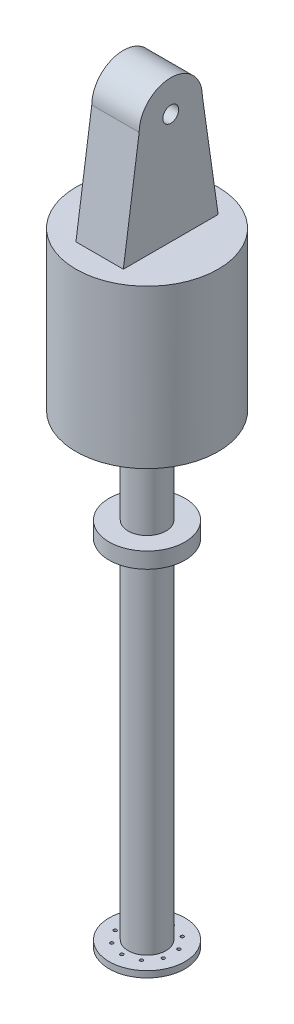
ISO-10303-21;
HEADER;
FILE_DESCRIPTION(('STEP AP214'),'2;1');
FILE_NAME('part.step','',(''),(''),'','','');
FILE_SCHEMA(('AUTOMOTIVE_DESIGN { 1 0 10303 214 1 1 1 1 }'));
ENDSEC;
DATA;
#1=APPLICATION_CONTEXT('core data for automotive mechanical design processes');
#2=APPLICATION_PROTOCOL_DEFINITION('international standard','automotive_design',2000,#1);
#3=PRODUCT_CONTEXT('',#1,'mechanical');
#4=PRODUCT('Part','Part','',(#3));
#5=PRODUCT_RELATED_PRODUCT_CATEGORY('part','',(#4));
#6=PRODUCT_DEFINITION_FORMATION('','',#4);
#7=PRODUCT_DEFINITION_CONTEXT('part definition',#1,'design');
#8=PRODUCT_DEFINITION('design','',#6,#7);
#9=PRODUCT_DEFINITION_SHAPE('','',#8);
#10=(LENGTH_UNIT() NAMED_UNIT(*) SI_UNIT(.MILLI.,.METRE.));
#11=(NAMED_UNIT(*) PLANE_ANGLE_UNIT() SI_UNIT($,.RADIAN.));
#12=(NAMED_UNIT(*) SI_UNIT($,.STERADIAN.) SOLID_ANGLE_UNIT());
#13=UNCERTAINTY_MEASURE_WITH_UNIT(LENGTH_MEASURE(1.E-05),#10,'distance_accuracy_value','');
#14=(GEOMETRIC_REPRESENTATION_CONTEXT(3) GLOBAL_UNCERTAINTY_ASSIGNED_CONTEXT((#13)) GLOBAL_UNIT_ASSIGNED_CONTEXT((#10,
#11,#12)) REPRESENTATION_CONTEXT('',''));
#15=CARTESIAN_POINT('',(0.,0.,0.));
#16=DIRECTION('',(0.,0.,1.));
#17=DIRECTION('',(1.,0.,0.));
#18=AXIS2_PLACEMENT_3D('',#15,#16,#17);
#19=CARTESIAN_POINT('',(15.,64.,0.));
#20=DIRECTION('',(1.,0.,0.));
#21=DIRECTION('',(0.,0.,-1.));
#22=AXIS2_PLACEMENT_3D('',#19,#20,#21);
#23=PLANE('',#22);
#24=DIRECTION('',(0.,0.989949493661166,0.141421356237309));
#25=VECTOR('',#24,1.);
#26=CARTESIAN_POINT('',(15.,29.,-15.));
#27=LINE('',#26,#25);
#28=CARTESIAN_POINT('',(15.,29.,-15.));
#29=VERTEX_POINT('',#28);
#30=CARTESIAN_POINT('',(15.,64.,-10.));
#31=VERTEX_POINT('',#30);
#32=EDGE_CURVE('E97',#29,#31,#27,.T.);
#33=ORIENTED_EDGE('',*,*,#32,.T.);
#34=CARTESIAN_POINT('',(15.,64.,0.));
#35=DIRECTION('',(1.,0.,0.));
#36=DIRECTION('',(0.,0.,-1.));
#37=AXIS2_PLACEMENT_3D('',#34,#35,#36);
#38=CIRCLE('',#37,10.);
#39=CARTESIAN_POINT('',(15.,64.,10.));
#40=VERTEX_POINT('',#39);
#41=EDGE_CURVE('E83',#31,#40,#38,.T.);
#42=ORIENTED_EDGE('',*,*,#41,.T.);
#43=DIRECTION('',(0.,-0.989949493661166,0.141421356237309));
#44=VECTOR('',#43,1.);
#45=CARTESIAN_POINT('',(15.,64.,10.));
#46=LINE('',#45,#44);
#47=CARTESIAN_POINT('',(15.,29.,15.));
#48=VERTEX_POINT('',#47);
#49=EDGE_CURVE('E115',#40,#48,#46,.T.);
#50=ORIENTED_EDGE('',*,*,#49,.T.);
#51=DIRECTION('',(0.,0.,-1.));
#52=VECTOR('',#51,1.);
#53=CARTESIAN_POINT('',(15.,29.,15.));
#54=LINE('',#53,#52);
#55=EDGE_CURVE('E57',#48,#29,#54,.T.);
#56=ORIENTED_EDGE('',*,*,#55,.T.);
#57=EDGE_LOOP('',(#33,#42,#50,#56));
#58=FACE_BOUND('',#57,.T.);
#59=CARTESIAN_POINT('',(15.,64.,0.));
#60=DIRECTION('',(1.,0.,0.));
#61=DIRECTION('',(0.,0.,-1.));
#62=AXIS2_PLACEMENT_3D('',#59,#60,#61);
#63=CIRCLE('',#62,2.5);
#64=CARTESIAN_POINT('',(15.,64.,-2.5));
#65=VERTEX_POINT('',#64);
#66=EDGE_CURVE('E113',#65,#65,#63,.T.);
#67=ORIENTED_EDGE('',*,*,#66,.F.);
#68=EDGE_LOOP('',(#67));
#69=FACE_BOUND('',#68,.T.);
#70=ADVANCED_FACE('F38',(#58,#69),#23,.T.);
#71=CARTESIAN_POINT('',(0.,64.,0.));
#72=DIRECTION('',(1.,0.,0.));
#73=DIRECTION('',(0.,0.,-1.));
#74=AXIS2_PLACEMENT_3D('',#71,#72,#73);
#75=PLANE('',#74);
#76=DIRECTION('',(0.,0.989949493661166,0.141421356237309));
#77=VECTOR('',#76,1.);
#78=CARTESIAN_POINT('',(0.,29.,-15.));
#79=LINE('',#78,#77);
#80=CARTESIAN_POINT('',(0.,29.,-15.));
#81=VERTEX_POINT('',#80);
#82=CARTESIAN_POINT('',(0.,64.,-10.));
#83=VERTEX_POINT('',#82);
#84=EDGE_CURVE('E94',#81,#83,#79,.T.);
#85=ORIENTED_EDGE('',*,*,#84,.F.);
#86=DIRECTION('',(0.,0.,-1.));
#87=VECTOR('',#86,1.);
#88=CARTESIAN_POINT('',(0.,29.,15.));
#89=LINE('',#88,#87);
#90=CARTESIAN_POINT('',(0.,29.,15.));
#91=VERTEX_POINT('',#90);
#92=EDGE_CURVE('E89',#91,#81,#89,.T.);
#93=ORIENTED_EDGE('',*,*,#92,.F.);
#94=DIRECTION('',(0.,-0.989949493661166,0.141421356237309));
#95=VECTOR('',#94,1.);
#96=CARTESIAN_POINT('',(0.,64.,10.));
#97=LINE('',#96,#95);
#98=CARTESIAN_POINT('',(0.,64.,10.));
#99=VERTEX_POINT('',#98);
#100=EDGE_CURVE('E93',#99,#91,#97,.T.);
#101=ORIENTED_EDGE('',*,*,#100,.F.);
#102=CARTESIAN_POINT('',(0.,64.,0.));
#103=DIRECTION('',(1.,0.,0.));
#104=DIRECTION('',(0.,0.,-1.));
#105=AXIS2_PLACEMENT_3D('',#102,#103,#104);
#106=CIRCLE('',#105,10.);
#107=EDGE_CURVE('E71',#83,#99,#106,.T.);
#108=ORIENTED_EDGE('',*,*,#107,.F.);
#109=EDGE_LOOP('',(#85,#93,#101,#108));
#110=FACE_BOUND('',#109,.T.);
#111=CARTESIAN_POINT('',(0.,64.,0.));
#112=DIRECTION('',(1.,0.,0.));
#113=DIRECTION('',(0.,0.,-1.));
#114=AXIS2_PLACEMENT_3D('',#111,#112,#113);
#115=CIRCLE('',#114,2.5);
#116=CARTESIAN_POINT('',(0.,64.,-2.5));
#117=VERTEX_POINT('',#116);
#118=EDGE_CURVE('E119',#117,#117,#115,.T.);
#119=ORIENTED_EDGE('',*,*,#118,.T.);
#120=EDGE_LOOP('',(#119));
#121=FACE_BOUND('',#120,.T.);
#122=ADVANCED_FACE('F91',(#110,#121),#75,.F.);
#123=CARTESIAN_POINT('',(15.,29.,-15.));
#124=DIRECTION('',(0.,-0.141421356237309,0.989949493661166));
#125=DIRECTION('',(0.,-0.989949493661167,-0.141421356237309));
#126=AXIS2_PLACEMENT_3D('',#123,#124,#125);
#127=PLANE('',#126);
#128=ORIENTED_EDGE('',*,*,#84,.T.);
#129=DIRECTION('',(-1.,0.,0.));
#130=VECTOR('',#129,1.);
#131=CARTESIAN_POINT('',(15.,64.,-10.));
#132=LINE('',#131,#130);
#133=EDGE_CURVE('E42',#31,#83,#132,.T.);
#134=ORIENTED_EDGE('',*,*,#133,.F.);
#135=ORIENTED_EDGE('',*,*,#32,.F.);
#136=DIRECTION('',(-1.,0.,0.));
#137=VECTOR('',#136,1.);
#138=CARTESIAN_POINT('',(15.,29.,-15.));
#139=LINE('',#138,#137);
#140=EDGE_CURVE('E78',#29,#81,#139,.T.);
#141=ORIENTED_EDGE('',*,*,#140,.T.);
#142=EDGE_LOOP('',(#128,#134,#135,#141));
#143=FACE_BOUND('',#142,.T.);
#144=ADVANCED_FACE('F40',(#143),#127,.F.);
#145=CARTESIAN_POINT('',(15.,64.,0.));
#146=DIRECTION('',(-1.,0.,0.));
#147=DIRECTION('',(0.,0.,1.));
#148=AXIS2_PLACEMENT_3D('',#145,#146,#147);
#149=CYLINDRICAL_SURFACE('',#148,10.);
#150=ORIENTED_EDGE('',*,*,#107,.T.);
#151=DIRECTION('',(-1.,0.,0.));
#152=VECTOR('',#151,1.);
#153=CARTESIAN_POINT('',(15.,64.,10.));
#154=LINE('',#153,#152);
#155=EDGE_CURVE('E104',#40,#99,#154,.T.);
#156=ORIENTED_EDGE('',*,*,#155,.F.);
#157=ORIENTED_EDGE('',*,*,#41,.F.);
#158=ORIENTED_EDGE('',*,*,#133,.T.);
#159=EDGE_LOOP('',(#150,#156,#157,#158));
#160=FACE_BOUND('',#159,.T.);
#161=ADVANCED_FACE('F263',(#160),#149,.T.);
#162=CARTESIAN_POINT('',(15.,64.,10.));
#163=DIRECTION('',(0.,-0.141421356237309,-0.989949493661166));
#164=DIRECTION('',(0.,0.989949493661167,-0.141421356237309));
#165=AXIS2_PLACEMENT_3D('',#162,#163,#164);
#166=PLANE('',#165);
#167=ORIENTED_EDGE('',*,*,#100,.T.);
#168=DIRECTION('',(-1.,0.,0.));
#169=VECTOR('',#168,1.);
#170=CARTESIAN_POINT('',(15.,29.,15.));
#171=LINE('',#170,#169);
#172=EDGE_CURVE('E103',#48,#91,#171,.T.);
#173=ORIENTED_EDGE('',*,*,#172,.F.);
#174=ORIENTED_EDGE('',*,*,#49,.F.);
#175=ORIENTED_EDGE('',*,*,#155,.T.);
#176=EDGE_LOOP('',(#167,#173,#174,#175));
#177=FACE_BOUND('',#176,.T.);
#178=ADVANCED_FACE('F101',(#177),#166,.F.);
#179=CARTESIAN_POINT('',(15.,64.,0.));
#180=DIRECTION('',(-1.,0.,0.));
#181=DIRECTION('',(0.,0.,1.));
#182=AXIS2_PLACEMENT_3D('',#179,#180,#181);
#183=CYLINDRICAL_SURFACE('',#182,2.5);
#184=ORIENTED_EDGE('',*,*,#66,.T.);
#185=EDGE_LOOP('',(#184));
#186=FACE_BOUND('',#185,.T.);
#187=ORIENTED_EDGE('',*,*,#118,.F.);
#188=EDGE_LOOP('',(#187));
#189=FACE_BOUND('',#188,.T.);
#190=ADVANCED_FACE('F259',(#186,#189),#183,.F.);
#191=CARTESIAN_POINT('',(7.5,92.6396103067893,0.));
#192=DIRECTION('',(0.,-1.,0.));
#193=DIRECTION('',(0.,0.,-1.));
#194=AXIS2_PLACEMENT_3D('',#191,#192,#193);
#195=CYLINDRICAL_SURFACE('',#194,22.5);
#196=CARTESIAN_POINT('',(7.5,29.,0.));
#197=DIRECTION('',(0.,1.,0.));
#198=DIRECTION('',(0.,0.,1.));
#199=AXIS2_PLACEMENT_3D('',#196,#197,#198);
#200=CIRCLE('',#199,22.5);
#201=CARTESIAN_POINT('',(7.5,29.,22.5));
#202=VERTEX_POINT('',#201);
#203=EDGE_CURVE('E122',#202,#202,#200,.T.);
#204=ORIENTED_EDGE('',*,*,#203,.F.);
#205=EDGE_LOOP('',(#204));
#206=FACE_BOUND('',#205,.T.);
#207=CARTESIAN_POINT('',(7.5,-21.,0.));
#208=DIRECTION('',(0.,-1.,0.));
#209=DIRECTION('',(0.,0.,-1.));
#210=AXIS2_PLACEMENT_3D('',#207,#208,#209);
#211=CIRCLE('',#210,22.5);
#212=CARTESIAN_POINT('',(7.5,-21.,-22.5));
#213=VERTEX_POINT('',#212);
#214=EDGE_CURVE('E127',#213,#213,#211,.T.);
#215=ORIENTED_EDGE('',*,*,#214,.F.);
#216=EDGE_LOOP('',(#215));
#217=FACE_BOUND('',#216,.T.);
#218=ADVANCED_FACE('F288',(#206,#217),#195,.T.);
#219=CARTESIAN_POINT('',(15.,29.,15.));
#220=DIRECTION('',(0.,1.,0.));
#221=DIRECTION('',(0.,0.,1.));
#222=AXIS2_PLACEMENT_3D('',#219,#220,#221);
#223=PLANE('',#222);
#224=ORIENTED_EDGE('',*,*,#172,.T.);
#225=ORIENTED_EDGE('',*,*,#92,.T.);
#226=ORIENTED_EDGE('',*,*,#140,.F.);
#227=ORIENTED_EDGE('',*,*,#55,.F.);
#228=EDGE_LOOP('',(#224,#225,#226,#227));
#229=FACE_BOUND('',#228,.T.);
#230=ORIENTED_EDGE('',*,*,#203,.T.);
#231=EDGE_LOOP('',(#230));
#232=FACE_BOUND('',#231,.T.);
#233=ADVANCED_FACE('F106',(#229,#232),#223,.T.);
#234=CARTESIAN_POINT('',(7.5,-21.,0.));
#235=DIRECTION('',(0.,-1.,0.));
#236=DIRECTION('',(0.,0.,-1.));
#237=AXIS2_PLACEMENT_3D('',#234,#235,#236);
#238=PLANE('',#237);
#239=CARTESIAN_POINT('',(7.5,-21.,0.));
#240=DIRECTION('',(0.,-1.,0.));
#241=DIRECTION('',(0.,0.,-1.));
#242=AXIS2_PLACEMENT_3D('',#239,#240,#241);
#243=CIRCLE('',#242,6.);
#244=CARTESIAN_POINT('',(7.5,-21.,-6.));
#245=VERTEX_POINT('',#244);
#246=EDGE_CURVE('E48',#245,#245,#243,.T.);
#247=ORIENTED_EDGE('',*,*,#246,.F.);
#248=EDGE_LOOP('',(#247));
#249=FACE_BOUND('',#248,.T.);
#250=ORIENTED_EDGE('',*,*,#214,.T.);
#251=EDGE_LOOP('',(#250));
#252=FACE_BOUND('',#251,.T.);
#253=ADVANCED_FACE('F311',(#249,#252),#238,.T.);
#254=CARTESIAN_POINT('',(7.5,-51.,0.));
#255=DIRECTION('',(0.,1.,0.));
#256=DIRECTION('',(0.,0.,1.));
#257=AXIS2_PLACEMENT_3D('',#254,#255,#256);
#258=CYLINDRICAL_SURFACE('',#257,6.);
#259=CARTESIAN_POINT('',(7.5,-51.,0.));
#260=DIRECTION('',(0.,-1.,0.));
#261=DIRECTION('',(0.,0.,-1.));
#262=AXIS2_PLACEMENT_3D('',#259,#260,#261);
#263=CIRCLE('',#262,6.);
#264=CARTESIAN_POINT('',(7.5,-51.,-6.));
#265=VERTEX_POINT('',#264);
#266=EDGE_CURVE('E130',#265,#265,#263,.T.);
#267=ORIENTED_EDGE('',*,*,#266,.F.);
#268=EDGE_LOOP('',(#267));
#269=FACE_BOUND('',#268,.T.);
#270=ORIENTED_EDGE('',*,*,#246,.T.);
#271=EDGE_LOOP('',(#270));
#272=FACE_BOUND('',#271,.T.);
#273=ADVANCED_FACE('F328',(#269,#272),#258,.T.);
#274=CARTESIAN_POINT('',(7.5,-56.,0.));
#275=DIRECTION('',(0.,1.,0.));
#276=DIRECTION('',(0.,0.,1.));
#277=AXIS2_PLACEMENT_3D('',#274,#275,#276);
#278=CYLINDRICAL_SURFACE('',#277,12.);
#279=CARTESIAN_POINT('',(7.5,-56.,0.));
#280=DIRECTION('',(0.,-1.,0.));
#281=DIRECTION('',(0.,0.,-1.));
#282=AXIS2_PLACEMENT_3D('',#279,#280,#281);
#283=CIRCLE('',#282,12.);
#284=CARTESIAN_POINT('',(7.5,-56.,-12.));
#285=VERTEX_POINT('',#284);
#286=EDGE_CURVE('E135',#285,#285,#283,.T.);
#287=ORIENTED_EDGE('',*,*,#286,.F.);
#288=EDGE_LOOP('',(#287));
#289=FACE_BOUND('',#288,.T.);
#290=CARTESIAN_POINT('',(7.5,-51.,0.));
#291=DIRECTION('',(0.,-1.,0.));
#292=DIRECTION('',(0.,0.,-1.));
#293=AXIS2_PLACEMENT_3D('',#290,#291,#292);
#294=CIRCLE('',#293,12.);
#295=CARTESIAN_POINT('',(7.5,-51.,-12.));
#296=VERTEX_POINT('',#295);
#297=EDGE_CURVE('E136',#296,#296,#294,.T.);
#298=ORIENTED_EDGE('',*,*,#297,.T.);
#299=EDGE_LOOP('',(#298));
#300=FACE_BOUND('',#299,.T.);
#301=ADVANCED_FACE('F338',(#289,#300),#278,.T.);
#302=CARTESIAN_POINT('',(7.5,-56.,0.));
#303=DIRECTION('',(0.,-1.,0.));
#304=DIRECTION('',(0.,0.,-1.));
#305=AXIS2_PLACEMENT_3D('',#302,#303,#304);
#306=PLANE('',#305);
#307=CARTESIAN_POINT('',(7.5,-56.,0.));
#308=DIRECTION('',(0.,-1.,0.));
#309=DIRECTION('',(0.,0.,-1.));
#310=AXIS2_PLACEMENT_3D('',#307,#308,#309);
#311=CIRCLE('',#310,6.);
#312=CARTESIAN_POINT('',(7.5,-56.,-6.));
#313=VERTEX_POINT('',#312);
#314=EDGE_CURVE('E11',#313,#313,#311,.T.);
#315=ORIENTED_EDGE('',*,*,#314,.F.);
#316=EDGE_LOOP('',(#315));
#317=FACE_BOUND('',#316,.T.);
#318=ORIENTED_EDGE('',*,*,#286,.T.);
#319=EDGE_LOOP('',(#318));
#320=FACE_BOUND('',#319,.T.);
#321=ADVANCED_FACE('F348',(#317,#320),#306,.T.);
#322=CARTESIAN_POINT('',(7.5,-51.,0.));
#323=DIRECTION('',(0.,-1.,0.));
#324=DIRECTION('',(0.,0.,-1.));
#325=AXIS2_PLACEMENT_3D('',#322,#323,#324);
#326=PLANE('',#325);
#327=ORIENTED_EDGE('',*,*,#266,.T.);
#328=EDGE_LOOP('',(#327));
#329=FACE_BOUND('',#328,.T.);
#330=ORIENTED_EDGE('',*,*,#297,.F.);
#331=EDGE_LOOP('',(#330));
#332=FACE_BOUND('',#331,.T.);
#333=ADVANCED_FACE('F356',(#329,#332),#326,.F.);
#334=CARTESIAN_POINT('',(7.5,-166.,0.));
#335=DIRECTION('',(0.,1.,0.));
#336=DIRECTION('',(0.,0.,1.));
#337=AXIS2_PLACEMENT_3D('',#334,#335,#336);
#338=CYLINDRICAL_SURFACE('',#337,6.);
#339=CARTESIAN_POINT('',(7.5,-166.,0.));
#340=DIRECTION('',(0.,-1.,0.));
#341=DIRECTION('',(0.,0.,-1.));
#342=AXIS2_PLACEMENT_3D('',#339,#340,#341);
#343=CIRCLE('',#342,6.);
#344=CARTESIAN_POINT('',(7.5,-166.,-6.));
#345=VERTEX_POINT('',#344);
#346=EDGE_CURVE('E139',#345,#345,#343,.T.);
#347=ORIENTED_EDGE('',*,*,#346,.F.);
#348=EDGE_LOOP('',(#347));
#349=FACE_BOUND('',#348,.T.);
#350=ORIENTED_EDGE('',*,*,#314,.T.);
#351=EDGE_LOOP('',(#350));
#352=FACE_BOUND('',#351,.T.);
#353=ADVANCED_FACE('F361',(#349,#352),#338,.T.);
#354=CARTESIAN_POINT('',(7.5,-168.,8.));
#355=DIRECTION('',(0.,1.,0.));
#356=DIRECTION('',(0.,0.,1.));
#357=AXIS2_PLACEMENT_3D('',#354,#355,#356);
#358=CYLINDRICAL_SURFACE('',#357,0.500000000000001);
#359=CARTESIAN_POINT('',(7.5,-168.,8.));
#360=DIRECTION('',(0.,-1.,0.));
#361=DIRECTION('',(0.,0.,-1.));
#362=AXIS2_PLACEMENT_3D('',#359,#360,#361);
#363=CIRCLE('',#362,0.500000000000001);
#364=CARTESIAN_POINT('',(7.5,-168.,7.5));
#365=VERTEX_POINT('',#364);
#366=EDGE_CURVE('E181',#365,#365,#363,.T.);
#367=ORIENTED_EDGE('',*,*,#366,.T.);
#368=EDGE_LOOP('',(#367));
#369=FACE_BOUND('',#368,.T.);
#370=CARTESIAN_POINT('',(7.5,-166.,8.));
#371=DIRECTION('',(0.,-1.,0.));
#372=DIRECTION('',(0.,0.,-1.));
#373=AXIS2_PLACEMENT_3D('',#370,#371,#372);
#374=CIRCLE('',#373,0.500000000000001);
#375=CARTESIAN_POINT('',(7.5,-166.,7.5));
#376=VERTEX_POINT('',#375);
#377=EDGE_CURVE('E149',#376,#376,#374,.T.);
#378=ORIENTED_EDGE('',*,*,#377,.F.);
#379=EDGE_LOOP('',(#378));
#380=FACE_BOUND('',#379,.T.);
#381=ADVANCED_FACE('F378',(#369,#380),#358,.F.);
#382=CARTESIAN_POINT('',(2.79771798166021,-168.,6.47213595499958));
#383=DIRECTION('',(0.,1.,0.));
#384=DIRECTION('',(0.,0.,1.));
#385=AXIS2_PLACEMENT_3D('',#382,#383,#384);
#386=CYLINDRICAL_SURFACE('',#385,0.500000000000002);
#387=CARTESIAN_POINT('',(2.79771798166021,-168.,6.47213595499958));
#388=DIRECTION('',(0.,-1.,0.));
#389=DIRECTION('',(0.,0.,-1.));
#390=AXIS2_PLACEMENT_3D('',#387,#388,#389);
#391=CIRCLE('',#390,0.500000000000002);
#392=CARTESIAN_POINT('',(2.79771798166021,-168.,5.97213595499958));
#393=VERTEX_POINT('',#392);
#394=EDGE_CURVE('E184',#393,#393,#391,.T.);
#395=ORIENTED_EDGE('',*,*,#394,.T.);
#396=EDGE_LOOP('',(#395));
#397=FACE_BOUND('',#396,.T.);
#398=CARTESIAN_POINT('',(2.79771798166021,-166.,6.47213595499958));
#399=DIRECTION('',(0.,-1.,0.));
#400=DIRECTION('',(0.,0.,-1.));
#401=AXIS2_PLACEMENT_3D('',#398,#399,#400);
#402=CIRCLE('',#401,0.500000000000002);
#403=CARTESIAN_POINT('',(2.79771798166021,-166.,5.97213595499958));
#404=VERTEX_POINT('',#403);
#405=EDGE_CURVE('E152',#404,#404,#402,.T.);
#406=ORIENTED_EDGE('',*,*,#405,.F.);
#407=EDGE_LOOP('',(#406));
#408=FACE_BOUND('',#407,.T.);
#409=ADVANCED_FACE('F388',(#397,#408),#386,.F.);
#410=CARTESIAN_POINT('',(-0.10845213036123,-168.,2.47213595499958));
#411=DIRECTION('',(0.,1.,0.));
#412=DIRECTION('',(0.,0.,1.));
#413=AXIS2_PLACEMENT_3D('',#410,#411,#412);
#414=CYLINDRICAL_SURFACE('',#413,0.5);
#415=CARTESIAN_POINT('',(-0.10845213036123,-168.,2.47213595499958));
#416=DIRECTION('',(0.,-1.,0.));
#417=DIRECTION('',(0.,0.,-1.));
#418=AXIS2_PLACEMENT_3D('',#415,#416,#417);
#419=CIRCLE('',#418,0.5);
#420=CARTESIAN_POINT('',(-0.10845213036123,-168.,1.97213595499958));
#421=VERTEX_POINT('',#420);
#422=EDGE_CURVE('E187',#421,#421,#419,.T.);
#423=ORIENTED_EDGE('',*,*,#422,.T.);
#424=EDGE_LOOP('',(#423));
#425=FACE_BOUND('',#424,.T.);
#426=CARTESIAN_POINT('',(-0.10845213036123,-166.,2.47213595499958));
#427=DIRECTION('',(0.,-1.,0.));
#428=DIRECTION('',(0.,0.,-1.));
#429=AXIS2_PLACEMENT_3D('',#426,#427,#428);
#430=CIRCLE('',#429,0.5);
#431=CARTESIAN_POINT('',(-0.10845213036123,-166.,1.97213595499958));
#432=VERTEX_POINT('',#431);
#433=EDGE_CURVE('E155',#432,#432,#430,.T.);
#434=ORIENTED_EDGE('',*,*,#433,.F.);
#435=EDGE_LOOP('',(#434));
#436=FACE_BOUND('',#435,.T.);
#437=ADVANCED_FACE('F398',(#425,#436),#414,.F.);
#438=CARTESIAN_POINT('',(-0.108452130361232,-168.,-2.47213595499958));
#439=DIRECTION('',(0.,1.,0.));
#440=DIRECTION('',(0.,0.,1.));
#441=AXIS2_PLACEMENT_3D('',#438,#439,#440);
#442=CYLINDRICAL_SURFACE('',#441,0.500000000000001);
#443=CARTESIAN_POINT('',(-0.108452130361232,-168.,-2.47213595499958));
#444=DIRECTION('',(0.,-1.,0.));
#445=DIRECTION('',(0.,0.,-1.));
#446=AXIS2_PLACEMENT_3D('',#443,#444,#445);
#447=CIRCLE('',#446,0.500000000000001);
#448=CARTESIAN_POINT('',(-0.108452130361232,-168.,-2.97213595499958));
#449=VERTEX_POINT('',#448);
#450=EDGE_CURVE('E190',#449,#449,#447,.T.);
#451=ORIENTED_EDGE('',*,*,#450,.T.);
#452=EDGE_LOOP('',(#451));
#453=FACE_BOUND('',#452,.T.);
#454=CARTESIAN_POINT('',(-0.108452130361232,-166.,-2.47213595499958));
#455=DIRECTION('',(0.,-1.,0.));
#456=DIRECTION('',(0.,0.,-1.));
#457=AXIS2_PLACEMENT_3D('',#454,#455,#456);
#458=CIRCLE('',#457,0.500000000000001);
#459=CARTESIAN_POINT('',(-0.108452130361232,-166.,-2.97213595499958));
#460=VERTEX_POINT('',#459);
#461=EDGE_CURVE('E158',#460,#460,#458,.T.);
#462=ORIENTED_EDGE('',*,*,#461,.F.);
#463=EDGE_LOOP('',(#462));
#464=FACE_BOUND('',#463,.T.);
#465=ADVANCED_FACE('F408',(#453,#464),#442,.F.);
#466=CARTESIAN_POINT('',(2.79771798166021,-168.,-6.47213595499958));
#467=DIRECTION('',(0.,1.,0.));
#468=DIRECTION('',(0.,0.,1.));
#469=AXIS2_PLACEMENT_3D('',#466,#467,#468);
#470=CYLINDRICAL_SURFACE('',#469,0.500000000000002);
#471=CARTESIAN_POINT('',(2.79771798166021,-168.,-6.47213595499958));
#472=DIRECTION('',(0.,-1.,0.));
#473=DIRECTION('',(0.,0.,-1.));
#474=AXIS2_PLACEMENT_3D('',#471,#472,#473);
#475=CIRCLE('',#474,0.500000000000002);
#476=CARTESIAN_POINT('',(2.79771798166021,-168.,-6.97213595499958));
#477=VERTEX_POINT('',#476);
#478=EDGE_CURVE('E193',#477,#477,#475,.T.);
#479=ORIENTED_EDGE('',*,*,#478,.T.);
#480=EDGE_LOOP('',(#479));
#481=FACE_BOUND('',#480,.T.);
#482=CARTESIAN_POINT('',(2.79771798166021,-166.,-6.47213595499958));
#483=DIRECTION('',(0.,-1.,0.));
#484=DIRECTION('',(0.,0.,-1.));
#485=AXIS2_PLACEMENT_3D('',#482,#483,#484);
#486=CIRCLE('',#485,0.500000000000002);
#487=CARTESIAN_POINT('',(2.79771798166021,-166.,-6.97213595499958));
#488=VERTEX_POINT('',#487);
#489=EDGE_CURVE('E161',#488,#488,#486,.T.);
#490=ORIENTED_EDGE('',*,*,#489,.F.);
#491=EDGE_LOOP('',(#490));
#492=FACE_BOUND('',#491,.T.);
#493=ADVANCED_FACE('F418',(#481,#492),#470,.F.);
#494=CARTESIAN_POINT('',(7.5,-168.,-8.));
#495=DIRECTION('',(0.,1.,0.));
#496=DIRECTION('',(0.,0.,1.));
#497=AXIS2_PLACEMENT_3D('',#494,#495,#496);
#498=CYLINDRICAL_SURFACE('',#497,0.500000000000001);
#499=CARTESIAN_POINT('',(7.5,-168.,-8.));
#500=DIRECTION('',(0.,-1.,0.));
#501=DIRECTION('',(0.,0.,-1.));
#502=AXIS2_PLACEMENT_3D('',#499,#500,#501);
#503=CIRCLE('',#502,0.500000000000001);
#504=CARTESIAN_POINT('',(7.5,-168.,-8.5));
#505=VERTEX_POINT('',#504);
#506=EDGE_CURVE('E196',#505,#505,#503,.T.);
#507=ORIENTED_EDGE('',*,*,#506,.T.);
#508=EDGE_LOOP('',(#507));
#509=FACE_BOUND('',#508,.T.);
#510=CARTESIAN_POINT('',(7.5,-166.,-8.));
#511=DIRECTION('',(0.,-1.,0.));
#512=DIRECTION('',(0.,0.,-1.));
#513=AXIS2_PLACEMENT_3D('',#510,#511,#512);
#514=CIRCLE('',#513,0.500000000000001);
#515=CARTESIAN_POINT('',(7.5,-166.,-8.5));
#516=VERTEX_POINT('',#515);
#517=EDGE_CURVE('E164',#516,#516,#514,.T.);
#518=ORIENTED_EDGE('',*,*,#517,.F.);
#519=EDGE_LOOP('',(#518));
#520=FACE_BOUND('',#519,.T.);
#521=ADVANCED_FACE('F428',(#509,#520),#498,.F.);
#522=CARTESIAN_POINT('',(12.2022820183398,-168.,-6.47213595499958));
#523=DIRECTION('',(0.,1.,0.));
#524=DIRECTION('',(0.,0.,1.));
#525=AXIS2_PLACEMENT_3D('',#522,#523,#524);
#526=CYLINDRICAL_SURFACE('',#525,0.500000000000001);
#527=CARTESIAN_POINT('',(12.2022820183398,-168.,-6.47213595499958));
#528=DIRECTION('',(0.,-1.,0.));
#529=DIRECTION('',(0.,0.,-1.));
#530=AXIS2_PLACEMENT_3D('',#527,#528,#529);
#531=CIRCLE('',#530,0.500000000000001);
#532=CARTESIAN_POINT('',(12.2022820183398,-168.,-6.97213595499958));
#533=VERTEX_POINT('',#532);
#534=EDGE_CURVE('E199',#533,#533,#531,.T.);
#535=ORIENTED_EDGE('',*,*,#534,.T.);
#536=EDGE_LOOP('',(#535));
#537=FACE_BOUND('',#536,.T.);
#538=CARTESIAN_POINT('',(12.2022820183398,-166.,-6.47213595499958));
#539=DIRECTION('',(0.,-1.,0.));
#540=DIRECTION('',(0.,0.,-1.));
#541=AXIS2_PLACEMENT_3D('',#538,#539,#540);
#542=CIRCLE('',#541,0.500000000000001);
#543=CARTESIAN_POINT('',(12.2022820183398,-166.,-6.97213595499958));
#544=VERTEX_POINT('',#543);
#545=EDGE_CURVE('E167',#544,#544,#542,.T.);
#546=ORIENTED_EDGE('',*,*,#545,.F.);
#547=EDGE_LOOP('',(#546));
#548=FACE_BOUND('',#547,.T.);
#549=ADVANCED_FACE('F438',(#537,#548),#526,.F.);
#550=CARTESIAN_POINT('',(15.1084521303612,-168.,-2.47213595499958));
#551=DIRECTION('',(0.,1.,0.));
#552=DIRECTION('',(0.,0.,1.));
#553=AXIS2_PLACEMENT_3D('',#550,#551,#552);
#554=CYLINDRICAL_SURFACE('',#553,0.499999999999999);
#555=CARTESIAN_POINT('',(15.1084521303612,-168.,-2.47213595499958));
#556=DIRECTION('',(0.,-1.,0.));
#557=DIRECTION('',(0.,0.,-1.));
#558=AXIS2_PLACEMENT_3D('',#555,#556,#557);
#559=CIRCLE('',#558,0.499999999999999);
#560=CARTESIAN_POINT('',(15.1084521303612,-168.,-2.97213595499958));
#561=VERTEX_POINT('',#560);
#562=EDGE_CURVE('E202',#561,#561,#559,.T.);
#563=ORIENTED_EDGE('',*,*,#562,.T.);
#564=EDGE_LOOP('',(#563));
#565=FACE_BOUND('',#564,.T.);
#566=CARTESIAN_POINT('',(15.1084521303612,-166.,-2.47213595499958));
#567=DIRECTION('',(0.,-1.,0.));
#568=DIRECTION('',(0.,0.,-1.));
#569=AXIS2_PLACEMENT_3D('',#566,#567,#568);
#570=CIRCLE('',#569,0.499999999999999);
#571=CARTESIAN_POINT('',(15.1084521303612,-166.,-2.97213595499958));
#572=VERTEX_POINT('',#571);
#573=EDGE_CURVE('E170',#572,#572,#570,.T.);
#574=ORIENTED_EDGE('',*,*,#573,.F.);
#575=EDGE_LOOP('',(#574));
#576=FACE_BOUND('',#575,.T.);
#577=ADVANCED_FACE('F448',(#565,#576),#554,.F.);
#578=CARTESIAN_POINT('',(15.1084521303612,-168.,2.47213595499957));
#579=DIRECTION('',(0.,1.,0.));
#580=DIRECTION('',(0.,0.,1.));
#581=AXIS2_PLACEMENT_3D('',#578,#579,#580);
#582=CYLINDRICAL_SURFACE('',#581,0.499999999999999);
#583=CARTESIAN_POINT('',(15.1084521303612,-168.,2.47213595499957));
#584=DIRECTION('',(0.,-1.,0.));
#585=DIRECTION('',(0.,0.,-1.));
#586=AXIS2_PLACEMENT_3D('',#583,#584,#585);
#587=CIRCLE('',#586,0.499999999999999);
#588=CARTESIAN_POINT('',(15.1084521303612,-168.,1.97213595499957));
#589=VERTEX_POINT('',#588);
#590=EDGE_CURVE('E205',#589,#589,#587,.T.);
#591=ORIENTED_EDGE('',*,*,#590,.T.);
#592=EDGE_LOOP('',(#591));
#593=FACE_BOUND('',#592,.T.);
#594=CARTESIAN_POINT('',(15.1084521303612,-166.,2.47213595499957));
#595=DIRECTION('',(0.,-1.,0.));
#596=DIRECTION('',(0.,0.,-1.));
#597=AXIS2_PLACEMENT_3D('',#594,#595,#596);
#598=CIRCLE('',#597,0.499999999999999);
#599=CARTESIAN_POINT('',(15.1084521303612,-166.,1.97213595499957));
#600=VERTEX_POINT('',#599);
#601=EDGE_CURVE('E173',#600,#600,#598,.T.);
#602=ORIENTED_EDGE('',*,*,#601,.F.);
#603=EDGE_LOOP('',(#602));
#604=FACE_BOUND('',#603,.T.);
#605=ADVANCED_FACE('F458',(#593,#604),#582,.F.);
#606=CARTESIAN_POINT('',(12.2022820183398,-168.,6.47213595499958));
#607=DIRECTION('',(0.,1.,0.));
#608=DIRECTION('',(0.,0.,1.));
#609=AXIS2_PLACEMENT_3D('',#606,#607,#608);
#610=CYLINDRICAL_SURFACE('',#609,0.499999999999999);
#611=CARTESIAN_POINT('',(12.2022820183398,-168.,6.47213595499958));
#612=DIRECTION('',(0.,-1.,0.));
#613=DIRECTION('',(0.,0.,-1.));
#614=AXIS2_PLACEMENT_3D('',#611,#612,#613);
#615=CIRCLE('',#614,0.499999999999999);
#616=CARTESIAN_POINT('',(12.2022820183398,-168.,5.97213595499958));
#617=VERTEX_POINT('',#616);
#618=EDGE_CURVE('E148',#617,#617,#615,.T.);
#619=ORIENTED_EDGE('',*,*,#618,.T.);
#620=EDGE_LOOP('',(#619));
#621=FACE_BOUND('',#620,.T.);
#622=CARTESIAN_POINT('',(12.2022820183398,-166.,6.47213595499958));
#623=DIRECTION('',(0.,-1.,0.));
#624=DIRECTION('',(0.,0.,-1.));
#625=AXIS2_PLACEMENT_3D('',#622,#623,#624);
#626=CIRCLE('',#625,0.499999999999999);
#627=CARTESIAN_POINT('',(12.2022820183398,-166.,5.97213595499958));
#628=VERTEX_POINT('',#627);
#629=EDGE_CURVE('E176',#628,#628,#626,.T.);
#630=ORIENTED_EDGE('',*,*,#629,.F.);
#631=EDGE_LOOP('',(#630));
#632=FACE_BOUND('',#631,.T.);
#633=ADVANCED_FACE('F211',(#621,#632),#610,.F.);
#634=CARTESIAN_POINT('',(7.5,-168.,0.));
#635=DIRECTION('',(0.,1.,0.));
#636=DIRECTION('',(0.,0.,1.));
#637=AXIS2_PLACEMENT_3D('',#634,#635,#636);
#638=CYLINDRICAL_SURFACE('',#637,12.);
#639=CARTESIAN_POINT('',(7.5,-168.,0.));
#640=DIRECTION('',(0.,-1.,0.));
#641=DIRECTION('',(0.,0.,-1.));
#642=AXIS2_PLACEMENT_3D('',#639,#640,#641);
#643=CIRCLE('',#642,12.);
#644=CARTESIAN_POINT('',(7.5,-168.,-12.));
#645=VERTEX_POINT('',#644);
#646=EDGE_CURVE('E144',#645,#645,#643,.T.);
#647=ORIENTED_EDGE('',*,*,#646,.F.);
#648=EDGE_LOOP('',(#647));
#649=FACE_BOUND('',#648,.T.);
#650=CARTESIAN_POINT('',(7.5,-166.,0.));
#651=DIRECTION('',(0.,-1.,0.));
#652=DIRECTION('',(0.,0.,-1.));
#653=AXIS2_PLACEMENT_3D('',#650,#651,#652);
#654=CIRCLE('',#653,12.);
#655=CARTESIAN_POINT('',(7.5,-166.,-12.));
#656=VERTEX_POINT('',#655);
#657=EDGE_CURVE('E145',#656,#656,#654,.T.);
#658=ORIENTED_EDGE('',*,*,#657,.T.);
#659=EDGE_LOOP('',(#658));
#660=FACE_BOUND('',#659,.T.);
#661=ADVANCED_FACE('F218',(#649,#660),#638,.T.);
#662=CARTESIAN_POINT('',(0.,-168.,0.));
#663=DIRECTION('',(0.,-1.,0.));
#664=DIRECTION('',(0.,0.,-1.));
#665=AXIS2_PLACEMENT_3D('',#662,#663,#664);
#666=PLANE('',#665);
#667=ORIENTED_EDGE('',*,*,#618,.F.);
#668=EDGE_LOOP('',(#667));
#669=FACE_BOUND('',#668,.T.);
#670=ORIENTED_EDGE('',*,*,#590,.F.);
#671=EDGE_LOOP('',(#670));
#672=FACE_BOUND('',#671,.T.);
#673=ORIENTED_EDGE('',*,*,#562,.F.);
#674=EDGE_LOOP('',(#673));
#675=FACE_BOUND('',#674,.T.);
#676=ORIENTED_EDGE('',*,*,#534,.F.);
#677=EDGE_LOOP('',(#676));
#678=FACE_BOUND('',#677,.T.);
#679=ORIENTED_EDGE('',*,*,#506,.F.);
#680=EDGE_LOOP('',(#679));
#681=FACE_BOUND('',#680,.T.);
#682=ORIENTED_EDGE('',*,*,#478,.F.);
#683=EDGE_LOOP('',(#682));
#684=FACE_BOUND('',#683,.T.);
#685=ORIENTED_EDGE('',*,*,#450,.F.);
#686=EDGE_LOOP('',(#685));
#687=FACE_BOUND('',#686,.T.);
#688=ORIENTED_EDGE('',*,*,#422,.F.);
#689=EDGE_LOOP('',(#688));
#690=FACE_BOUND('',#689,.T.);
#691=ORIENTED_EDGE('',*,*,#394,.F.);
#692=EDGE_LOOP('',(#691));
#693=FACE_BOUND('',#692,.T.);
#694=ORIENTED_EDGE('',*,*,#366,.F.);
#695=EDGE_LOOP('',(#694));
#696=FACE_BOUND('',#695,.T.);
#697=ORIENTED_EDGE('',*,*,#646,.T.);
#698=EDGE_LOOP('',(#697));
#699=FACE_BOUND('',#698,.T.);
#700=ADVANCED_FACE('F214',(#669,#672,#675,#678,#681,#684,#687,#690,#693,#696,#699),#666,.T.);
#701=CARTESIAN_POINT('',(0.,-166.,0.));
#702=DIRECTION('',(0.,-1.,0.));
#703=DIRECTION('',(0.,0.,-1.));
#704=AXIS2_PLACEMENT_3D('',#701,#702,#703);
#705=PLANE('',#704);
#706=ORIENTED_EDGE('',*,*,#346,.T.);
#707=EDGE_LOOP('',(#706));
#708=FACE_BOUND('',#707,.T.);
#709=ORIENTED_EDGE('',*,*,#629,.T.);
#710=EDGE_LOOP('',(#709));
#711=FACE_BOUND('',#710,.T.);
#712=ORIENTED_EDGE('',*,*,#601,.T.);
#713=EDGE_LOOP('',(#712));
#714=FACE_BOUND('',#713,.T.);
#715=ORIENTED_EDGE('',*,*,#573,.T.);
#716=EDGE_LOOP('',(#715));
#717=FACE_BOUND('',#716,.T.);
#718=ORIENTED_EDGE('',*,*,#545,.T.);
#719=EDGE_LOOP('',(#718));
#720=FACE_BOUND('',#719,.T.);
#721=ORIENTED_EDGE('',*,*,#517,.T.);
#722=EDGE_LOOP('',(#721));
#723=FACE_BOUND('',#722,.T.);
#724=ORIENTED_EDGE('',*,*,#489,.T.);
#725=EDGE_LOOP('',(#724));
#726=FACE_BOUND('',#725,.T.);
#727=ORIENTED_EDGE('',*,*,#461,.T.);
#728=EDGE_LOOP('',(#727));
#729=FACE_BOUND('',#728,.T.);
#730=ORIENTED_EDGE('',*,*,#433,.T.);
#731=EDGE_LOOP('',(#730));
#732=FACE_BOUND('',#731,.T.);
#733=ORIENTED_EDGE('',*,*,#405,.T.);
#734=EDGE_LOOP('',(#733));
#735=FACE_BOUND('',#734,.T.);
#736=ORIENTED_EDGE('',*,*,#377,.T.);
#737=EDGE_LOOP('',(#736));
#738=FACE_BOUND('',#737,.T.);
#739=ORIENTED_EDGE('',*,*,#657,.F.);
#740=EDGE_LOOP('',(#739));
#741=FACE_BOUND('',#740,.T.);
#742=ADVANCED_FACE('F217',(#708,#711,#714,#717,#720,#723,#726,#729,#732,#735,#738,#741),#705,.F.);
#743=CLOSED_SHELL('',(#70,#122,#144,#161,#178,#190,#218,#233,#253,#273,#301,#321,#333,#353,#381,
#409,#437,#465,#493,#521,#549,#577,#605,#633,#661,#700,#742));
#744=MANIFOLD_SOLID_BREP('B2',#743);
#745=ADVANCED_BREP_SHAPE_REPRESENTATION('',(#18,#744),#14);
#746=SHAPE_DEFINITION_REPRESENTATION(#9,#745);
ENDSEC;
END-ISO-10303-21;
